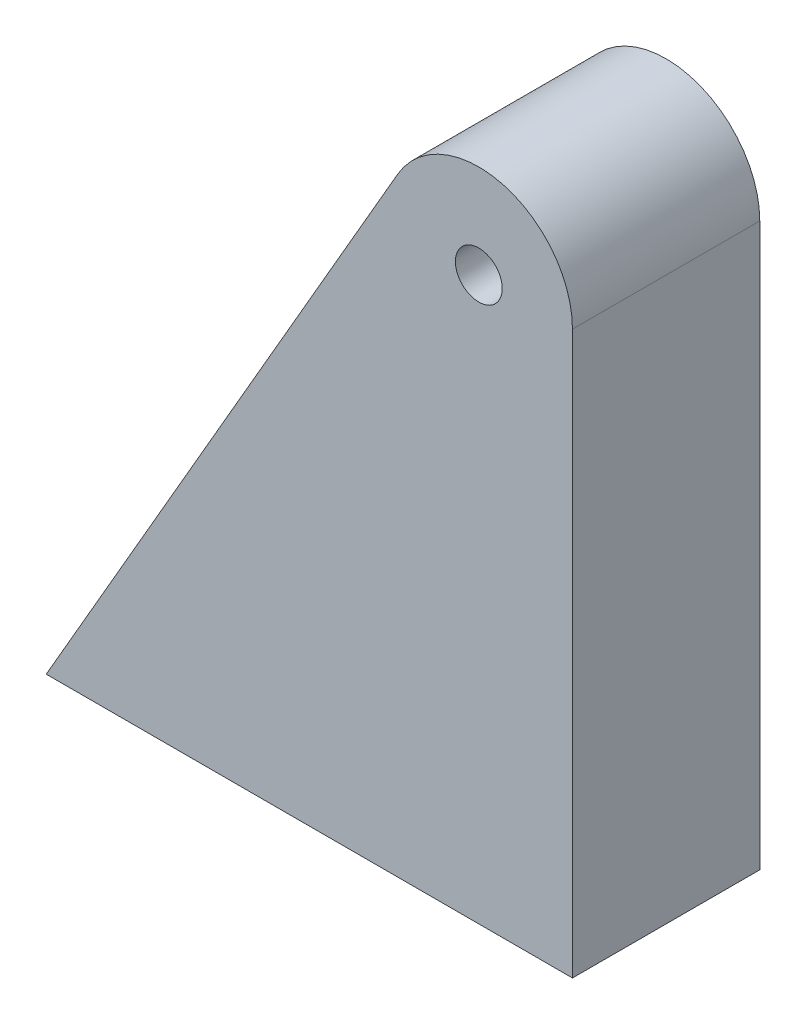
ISO-10303-21;
HEADER;
FILE_DESCRIPTION(('STEP AP214'),'2;1');
FILE_NAME('part.step','',(''),(''),'','','');
FILE_SCHEMA(('AUTOMOTIVE_DESIGN { 1 0 10303 214 1 1 1 1 }'));
ENDSEC;
DATA;
#1=APPLICATION_CONTEXT('core data for automotive mechanical design processes');
#2=APPLICATION_PROTOCOL_DEFINITION('international standard','automotive_design',2000,#1);
#3=PRODUCT_CONTEXT('',#1,'mechanical');
#4=PRODUCT('Part','Part','',(#3));
#5=PRODUCT_RELATED_PRODUCT_CATEGORY('part','',(#4));
#6=PRODUCT_DEFINITION_FORMATION('','',#4);
#7=PRODUCT_DEFINITION_CONTEXT('part definition',#1,'design');
#8=PRODUCT_DEFINITION('design','',#6,#7);
#9=PRODUCT_DEFINITION_SHAPE('','',#8);
#10=(LENGTH_UNIT() NAMED_UNIT(*) SI_UNIT(.MILLI.,.METRE.));
#11=(NAMED_UNIT(*) PLANE_ANGLE_UNIT() SI_UNIT($,.RADIAN.));
#12=(NAMED_UNIT(*) SI_UNIT($,.STERADIAN.) SOLID_ANGLE_UNIT());
#13=UNCERTAINTY_MEASURE_WITH_UNIT(LENGTH_MEASURE(1.E-05),#10,'distance_accuracy_value','');
#14=(GEOMETRIC_REPRESENTATION_CONTEXT(3) GLOBAL_UNCERTAINTY_ASSIGNED_CONTEXT((#13)) GLOBAL_UNIT_ASSIGNED_CONTEXT((#10,
#11,#12)) REPRESENTATION_CONTEXT('',''));
#15=CARTESIAN_POINT('',(0.,0.,0.));
#16=DIRECTION('',(0.,0.,1.));
#17=DIRECTION('',(1.,0.,0.));
#18=AXIS2_PLACEMENT_3D('',#15,#16,#17);
#19=CARTESIAN_POINT('',(29.3293936748328,38.1,12.7));
#20=DIRECTION('',(0.,0.,1.));
#21=DIRECTION('',(1.,0.,0.));
#22=AXIS2_PLACEMENT_3D('',#19,#20,#21);
#23=PLANE('',#22);
#24=DIRECTION('',(1.,0.,0.));
#25=VECTOR('',#24,1.);
#26=CARTESIAN_POINT('',(0.,0.,12.7));
#27=LINE('',#26,#25);
#28=CARTESIAN_POINT('',(0.,0.,12.7));
#29=VERTEX_POINT('',#28);
#30=CARTESIAN_POINT('',(35.6793936748328,0.,12.7));
#31=VERTEX_POINT('',#30);
#32=EDGE_CURVE('E87',#29,#31,#27,.T.);
#33=ORIENTED_EDGE('',*,*,#32,.T.);
#34=DIRECTION('',(0.,1.,0.));
#35=VECTOR('',#34,1.);
#36=CARTESIAN_POINT('',(35.6793936748328,0.,12.7));
#37=LINE('',#36,#35);
#38=CARTESIAN_POINT('',(35.6793936748328,38.1,12.7));
#39=VERTEX_POINT('',#38);
#40=EDGE_CURVE('E82',#31,#39,#37,.T.);
#41=ORIENTED_EDGE('',*,*,#40,.T.);
#42=CARTESIAN_POINT('',(29.3293936748328,38.1,12.7));
#43=DIRECTION('',(0.,0.,1.));
#44=DIRECTION('',(1.,0.,0.));
#45=AXIS2_PLACEMENT_3D('',#42,#43,#44);
#46=CIRCLE('',#45,6.35);
#47=CARTESIAN_POINT('',(23.8301323608017,41.275,12.7));
#48=VERTEX_POINT('',#47);
#49=EDGE_CURVE('E85',#39,#48,#46,.T.);
#50=ORIENTED_EDGE('',*,*,#49,.T.);
#51=DIRECTION('',(-0.499999999999998,-0.86602540378444,0.));
#52=VECTOR('',#51,1.);
#53=CARTESIAN_POINT('',(0.,0.,12.7));
#54=LINE('',#53,#52);
#55=EDGE_CURVE('E52',#48,#29,#54,.T.);
#56=ORIENTED_EDGE('',*,*,#55,.T.);
#57=EDGE_LOOP('',(#33,#41,#50,#56));
#58=FACE_BOUND('',#57,.T.);
#59=CARTESIAN_POINT('',(29.3293936748328,38.1,12.7));
#60=DIRECTION('',(0.,0.,1.));
#61=DIRECTION('',(1.,0.,0.));
#62=AXIS2_PLACEMENT_3D('',#59,#60,#61);
#63=CIRCLE('',#62,1.5875);
#64=CARTESIAN_POINT('',(30.9168936748328,38.1,12.7));
#65=VERTEX_POINT('',#64);
#66=EDGE_CURVE('E102',#65,#65,#63,.T.);
#67=ORIENTED_EDGE('',*,*,#66,.F.);
#68=EDGE_LOOP('',(#67));
#69=FACE_BOUND('',#68,.T.);
#70=ADVANCED_FACE('F35',(#58,#69),#23,.T.);
#71=CARTESIAN_POINT('',(29.3293936748328,38.1,0.));
#72=DIRECTION('',(0.,0.,1.));
#73=DIRECTION('',(1.,0.,0.));
#74=AXIS2_PLACEMENT_3D('',#71,#72,#73);
#75=PLANE('',#74);
#76=DIRECTION('',(1.,0.,0.));
#77=VECTOR('',#76,1.);
#78=CARTESIAN_POINT('',(0.,0.,0.));
#79=LINE('',#78,#77);
#80=CARTESIAN_POINT('',(0.,0.,0.));
#81=VERTEX_POINT('',#80);
#82=CARTESIAN_POINT('',(35.6793936748328,0.,0.));
#83=VERTEX_POINT('',#82);
#84=EDGE_CURVE('E99',#81,#83,#79,.T.);
#85=ORIENTED_EDGE('',*,*,#84,.F.);
#86=DIRECTION('',(-0.499999999999998,-0.86602540378444,0.));
#87=VECTOR('',#86,1.);
#88=CARTESIAN_POINT('',(0.,0.,0.));
#89=LINE('',#88,#87);
#90=CARTESIAN_POINT('',(23.8301323608017,41.275,0.));
#91=VERTEX_POINT('',#90);
#92=EDGE_CURVE('E75',#91,#81,#89,.T.);
#93=ORIENTED_EDGE('',*,*,#92,.F.);
#94=CARTESIAN_POINT('',(29.3293936748328,38.1,0.));
#95=DIRECTION('',(0.,0.,1.));
#96=DIRECTION('',(1.,0.,0.));
#97=AXIS2_PLACEMENT_3D('',#94,#95,#96);
#98=CIRCLE('',#97,6.35);
#99=CARTESIAN_POINT('',(35.6793936748328,38.1,0.));
#100=VERTEX_POINT('',#99);
#101=EDGE_CURVE('E69',#100,#91,#98,.T.);
#102=ORIENTED_EDGE('',*,*,#101,.F.);
#103=DIRECTION('',(0.,1.,0.));
#104=VECTOR('',#103,1.);
#105=CARTESIAN_POINT('',(35.6793936748328,0.,0.));
#106=LINE('',#105,#104);
#107=EDGE_CURVE('E91',#83,#100,#106,.T.);
#108=ORIENTED_EDGE('',*,*,#107,.F.);
#109=EDGE_LOOP('',(#85,#93,#102,#108));
#110=FACE_BOUND('',#109,.T.);
#111=CARTESIAN_POINT('',(29.3293936748328,38.1,0.));
#112=DIRECTION('',(0.,0.,1.));
#113=DIRECTION('',(1.,0.,0.));
#114=AXIS2_PLACEMENT_3D('',#111,#112,#113);
#115=CIRCLE('',#114,1.5875);
#116=CARTESIAN_POINT('',(30.9168936748328,38.1,0.));
#117=VERTEX_POINT('',#116);
#118=EDGE_CURVE('E114',#117,#117,#115,.T.);
#119=ORIENTED_EDGE('',*,*,#118,.T.);
#120=EDGE_LOOP('',(#119));
#121=FACE_BOUND('',#120,.T.);
#122=ADVANCED_FACE('F110',(#110,#121),#75,.F.);
#123=CARTESIAN_POINT('',(0.,0.,12.7));
#124=DIRECTION('',(0.,1.,0.));
#125=DIRECTION('',(0.,0.,1.));
#126=AXIS2_PLACEMENT_3D('',#123,#124,#125);
#127=PLANE('',#126);
#128=ORIENTED_EDGE('',*,*,#84,.T.);
#129=DIRECTION('',(0.,0.,-1.));
#130=VECTOR('',#129,1.);
#131=CARTESIAN_POINT('',(35.6793936748328,0.,12.7));
#132=LINE('',#131,#130);
#133=EDGE_CURVE('E11',#31,#83,#132,.T.);
#134=ORIENTED_EDGE('',*,*,#133,.F.);
#135=ORIENTED_EDGE('',*,*,#32,.F.);
#136=DIRECTION('',(0.,0.,-1.));
#137=VECTOR('',#136,1.);
#138=CARTESIAN_POINT('',(0.,0.,12.7));
#139=LINE('',#138,#137);
#140=EDGE_CURVE('E95',#29,#81,#139,.T.);
#141=ORIENTED_EDGE('',*,*,#140,.T.);
#142=EDGE_LOOP('',(#128,#134,#135,#141));
#143=FACE_BOUND('',#142,.T.);
#144=ADVANCED_FACE('F37',(#143),#127,.F.);
#145=CARTESIAN_POINT('',(35.6793936748328,0.,12.7));
#146=DIRECTION('',(-1.,0.,0.));
#147=DIRECTION('',(0.,0.,1.));
#148=AXIS2_PLACEMENT_3D('',#145,#146,#147);
#149=PLANE('',#148);
#150=ORIENTED_EDGE('',*,*,#107,.T.);
#151=DIRECTION('',(0.,0.,-1.));
#152=VECTOR('',#151,1.);
#153=CARTESIAN_POINT('',(35.6793936748328,38.1,12.7));
#154=LINE('',#153,#152);
#155=EDGE_CURVE('E44',#39,#100,#154,.T.);
#156=ORIENTED_EDGE('',*,*,#155,.F.);
#157=ORIENTED_EDGE('',*,*,#40,.F.);
#158=ORIENTED_EDGE('',*,*,#133,.T.);
#159=EDGE_LOOP('',(#150,#156,#157,#158));
#160=FACE_BOUND('',#159,.T.);
#161=ADVANCED_FACE('F90',(#160),#149,.F.);
#162=CARTESIAN_POINT('',(29.3293936748328,38.1,12.7));
#163=DIRECTION('',(0.,0.,-1.));
#164=DIRECTION('',(-1.,0.,0.));
#165=AXIS2_PLACEMENT_3D('',#162,#163,#164);
#166=CYLINDRICAL_SURFACE('',#165,6.35);
#167=ORIENTED_EDGE('',*,*,#101,.T.);
#168=DIRECTION('',(0.,0.,-1.));
#169=VECTOR('',#168,1.);
#170=CARTESIAN_POINT('',(23.8301323608017,41.275,12.7));
#171=LINE('',#170,#169);
#172=EDGE_CURVE('E92',#48,#91,#171,.T.);
#173=ORIENTED_EDGE('',*,*,#172,.F.);
#174=ORIENTED_EDGE('',*,*,#49,.F.);
#175=ORIENTED_EDGE('',*,*,#155,.T.);
#176=EDGE_LOOP('',(#167,#173,#174,#175));
#177=FACE_BOUND('',#176,.T.);
#178=ADVANCED_FACE('F93',(#177),#166,.T.);
#179=CARTESIAN_POINT('',(0.,0.,12.7));
#180=DIRECTION('',(0.86602540378444,-0.499999999999998,0.));
#181=DIRECTION('',(0.499999999999998,0.86602540378444,0.));
#182=AXIS2_PLACEMENT_3D('',#179,#180,#181);
#183=PLANE('',#182);
#184=ORIENTED_EDGE('',*,*,#92,.T.);
#185=ORIENTED_EDGE('',*,*,#140,.F.);
#186=ORIENTED_EDGE('',*,*,#55,.F.);
#187=ORIENTED_EDGE('',*,*,#172,.T.);
#188=EDGE_LOOP('',(#184,#185,#186,#187));
#189=FACE_BOUND('',#188,.T.);
#190=ADVANCED_FACE('F107',(#189),#183,.F.);
#191=CARTESIAN_POINT('',(29.3293936748328,38.1,12.7));
#192=DIRECTION('',(0.,0.,-1.));
#193=DIRECTION('',(-1.,0.,0.));
#194=AXIS2_PLACEMENT_3D('',#191,#192,#193);
#195=CYLINDRICAL_SURFACE('',#194,1.5875);
#196=ORIENTED_EDGE('',*,*,#66,.T.);
#197=EDGE_LOOP('',(#196));
#198=FACE_BOUND('',#197,.T.);
#199=ORIENTED_EDGE('',*,*,#118,.F.);
#200=EDGE_LOOP('',(#199));
#201=FACE_BOUND('',#200,.T.);
#202=ADVANCED_FACE('F120',(#198,#201),#195,.F.);
#203=CLOSED_SHELL('',(#70,#122,#144,#161,#178,#190,#202));
#204=MANIFOLD_SOLID_BREP('B2',#203);
#205=ADVANCED_BREP_SHAPE_REPRESENTATION('',(#18,#204),#14);
#206=SHAPE_DEFINITION_REPRESENTATION(#9,#205);
ENDSEC;
END-ISO-10303-21;
